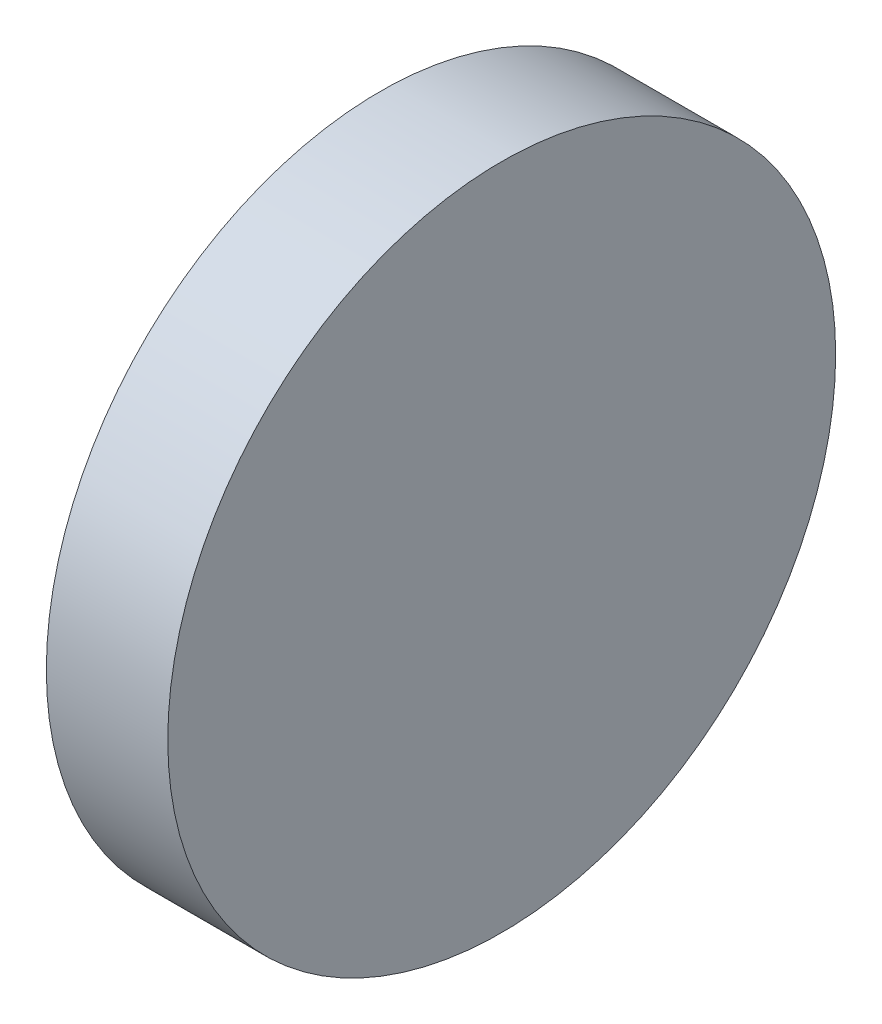
ISO-10303-21;
HEADER;
FILE_DESCRIPTION(('STEP AP214'),'2;1');
FILE_NAME('part.step','',(''),(''),'','','');
FILE_SCHEMA(('AUTOMOTIVE_DESIGN { 1 0 10303 214 1 1 1 1 }'));
ENDSEC;
DATA;
#1=APPLICATION_CONTEXT('core data for automotive mechanical design processes');
#2=APPLICATION_PROTOCOL_DEFINITION('international standard','automotive_design',2000,#1);
#3=PRODUCT_CONTEXT('',#1,'mechanical');
#4=PRODUCT('Part','Part','',(#3));
#5=PRODUCT_RELATED_PRODUCT_CATEGORY('part','',(#4));
#6=PRODUCT_DEFINITION_FORMATION('','',#4);
#7=PRODUCT_DEFINITION_CONTEXT('part definition',#1,'design');
#8=PRODUCT_DEFINITION('design','',#6,#7);
#9=PRODUCT_DEFINITION_SHAPE('','',#8);
#10=(LENGTH_UNIT() NAMED_UNIT(*) SI_UNIT(.MILLI.,.METRE.));
#11=(NAMED_UNIT(*) PLANE_ANGLE_UNIT() SI_UNIT($,.RADIAN.));
#12=(NAMED_UNIT(*) SI_UNIT($,.STERADIAN.) SOLID_ANGLE_UNIT());
#13=UNCERTAINTY_MEASURE_WITH_UNIT(LENGTH_MEASURE(1.E-05),#10,'distance_accuracy_value','');
#14=(GEOMETRIC_REPRESENTATION_CONTEXT(3) GLOBAL_UNCERTAINTY_ASSIGNED_CONTEXT((#13)) GLOBAL_UNIT_ASSIGNED_CONTEXT((#10,
#11,#12)) REPRESENTATION_CONTEXT('',''));
#15=CARTESIAN_POINT('',(0.,0.,0.));
#16=DIRECTION('',(0.,0.,1.));
#17=DIRECTION('',(1.,0.,0.));
#18=AXIS2_PLACEMENT_3D('',#15,#16,#17);
#19=CARTESIAN_POINT('',(159.7,11.,0.));
#20=DIRECTION('',(1.,0.,0.));
#21=DIRECTION('',(0.,0.,-1.));
#22=AXIS2_PLACEMENT_3D('',#19,#20,#21);
#23=PLANE('',#22);
#24=CARTESIAN_POINT('',(159.7,0.,0.));
#25=DIRECTION('',(-1.,0.,0.));
#26=DIRECTION('',(0.,0.,1.));
#27=AXIS2_PLACEMENT_3D('',#24,#25,#26);
#28=CIRCLE('',#27,11.);
#29=CARTESIAN_POINT('',(159.7,0.,11.));
#30=VERTEX_POINT('',#29);
#31=EDGE_CURVE('E44',#30,#30,#28,.T.);
#32=ORIENTED_EDGE('',*,*,#31,.T.);
#33=EDGE_LOOP('',(#32));
#34=FACE_BOUND('',#33,.T.);
#35=ADVANCED_FACE('F37',(#34),#23,.F.);
#36=CARTESIAN_POINT('',(163.7,0.,0.));
#37=DIRECTION('',(-1.,0.,0.));
#38=DIRECTION('',(0.,0.,1.));
#39=AXIS2_PLACEMENT_3D('',#36,#37,#38);
#40=PLANE('',#39);
#41=CARTESIAN_POINT('',(163.7,0.,0.));
#42=DIRECTION('',(-1.,0.,0.));
#43=DIRECTION('',(0.,0.,1.));
#44=AXIS2_PLACEMENT_3D('',#41,#42,#43);
#45=CIRCLE('',#44,11.);
#46=CARTESIAN_POINT('',(163.7,0.,11.));
#47=VERTEX_POINT('',#46);
#48=EDGE_CURVE('E10',#47,#47,#45,.T.);
#49=ORIENTED_EDGE('',*,*,#48,.F.);
#50=EDGE_LOOP('',(#49));
#51=FACE_BOUND('',#50,.T.);
#52=ADVANCED_FACE('F54',(#51),#40,.F.);
#53=CARTESIAN_POINT('',(-110.,0.,0.));
#54=DIRECTION('',(-1.,0.,0.));
#55=DIRECTION('',(0.,0.,1.));
#56=AXIS2_PLACEMENT_3D('',#53,#54,#55);
#57=CYLINDRICAL_SURFACE('',#56,11.);
#58=ORIENTED_EDGE('',*,*,#31,.F.);
#59=EDGE_LOOP('',(#58));
#60=FACE_BOUND('',#59,.T.);
#61=ORIENTED_EDGE('',*,*,#48,.T.);
#62=EDGE_LOOP('',(#61));
#63=FACE_BOUND('',#62,.T.);
#64=ADVANCED_FACE('F52',(#60,#63),#57,.T.);
#65=CLOSED_SHELL('',(#35,#52,#64));
#66=MANIFOLD_SOLID_BREP('B2',#65);
#67=ADVANCED_BREP_SHAPE_REPRESENTATION('',(#18,#66),#14);
#68=SHAPE_DEFINITION_REPRESENTATION(#9,#67);
ENDSEC;
END-ISO-10303-21;
